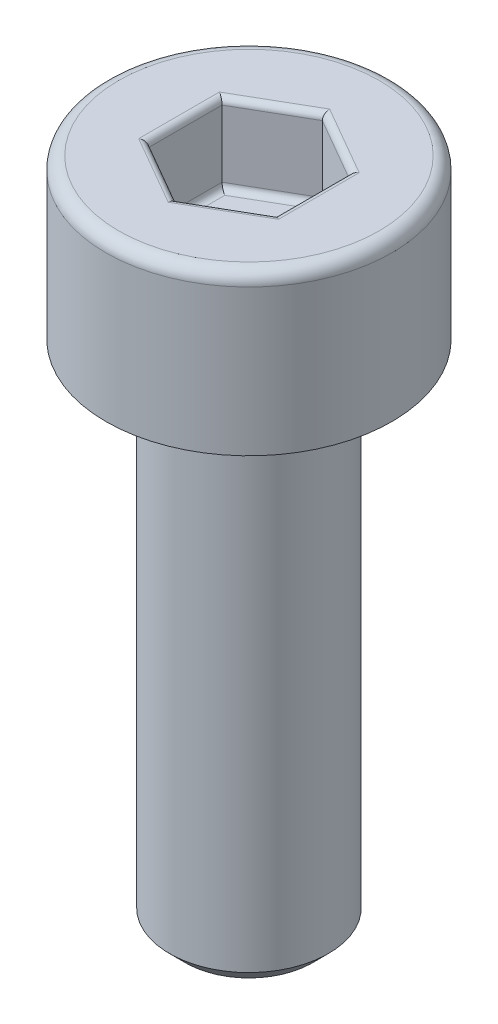
ISO-10303-21;
HEADER;
FILE_DESCRIPTION(('STEP AP214'),'2;1');
FILE_NAME('part.step','',(''),(''),'','','');
FILE_SCHEMA(('AUTOMOTIVE_DESIGN { 1 0 10303 214 1 1 1 1 }'));
ENDSEC;
DATA;
#1=APPLICATION_CONTEXT('core data for automotive mechanical design processes');
#2=APPLICATION_PROTOCOL_DEFINITION('international standard','automotive_design',2000,#1);
#3=PRODUCT_CONTEXT('',#1,'mechanical');
#4=PRODUCT('Part','Part','',(#3));
#5=PRODUCT_RELATED_PRODUCT_CATEGORY('part','',(#4));
#6=PRODUCT_DEFINITION_FORMATION('','',#4);
#7=PRODUCT_DEFINITION_CONTEXT('part definition',#1,'design');
#8=PRODUCT_DEFINITION('design','',#6,#7);
#9=PRODUCT_DEFINITION_SHAPE('','',#8);
#10=(LENGTH_UNIT() NAMED_UNIT(*) SI_UNIT(.MILLI.,.METRE.));
#11=(NAMED_UNIT(*) PLANE_ANGLE_UNIT() SI_UNIT($,.RADIAN.));
#12=(NAMED_UNIT(*) SI_UNIT($,.STERADIAN.) SOLID_ANGLE_UNIT());
#13=UNCERTAINTY_MEASURE_WITH_UNIT(LENGTH_MEASURE(1.E-05),#10,'distance_accuracy_value','');
#14=(GEOMETRIC_REPRESENTATION_CONTEXT(3) GLOBAL_UNCERTAINTY_ASSIGNED_CONTEXT((#13)) GLOBAL_UNIT_ASSIGNED_CONTEXT((#10,
#11,#12)) REPRESENTATION_CONTEXT('',''));
#15=CARTESIAN_POINT('',(0.,0.,0.));
#16=DIRECTION('',(0.,0.,1.));
#17=DIRECTION('',(1.,0.,0.));
#18=AXIS2_PLACEMENT_3D('',#15,#16,#17);
#19=CARTESIAN_POINT('',(0.,-10.5,0.));
#20=DIRECTION('',(0.,-1.,0.));
#21=DIRECTION('',(0.,0.,-1.));
#22=AXIS2_PLACEMENT_3D('',#19,#20,#21);
#23=PLANE('',#22);
#24=CARTESIAN_POINT('',(0.,-10.5,0.));
#25=DIRECTION('',(0.,-1.,0.));
#26=DIRECTION('',(0.,0.,-1.));
#27=AXIS2_PLACEMENT_3D('',#24,#25,#26);
#28=CIRCLE('',#27,0.999999999999999);
#29=CARTESIAN_POINT('',(0.,-10.5,-0.999999999999999));
#30=VERTEX_POINT('',#29);
#31=EDGE_CURVE('E261',#30,#30,#28,.T.);
#32=ORIENTED_EDGE('',*,*,#31,.T.);
#33=EDGE_LOOP('',(#32));
#34=FACE_BOUND('',#33,.T.);
#35=ADVANCED_FACE('F33',(#34),#23,.T.);
#36=CARTESIAN_POINT('',(0.,0.,0.));
#37=DIRECTION('',(0.,1.,0.));
#38=DIRECTION('',(0.,0.,1.));
#39=AXIS2_PLACEMENT_3D('',#36,#37,#38);
#40=CYLINDRICAL_SURFACE('',#39,1.25);
#41=CARTESIAN_POINT('',(0.,-2.75,0.));
#42=DIRECTION('',(0.,-1.,0.));
#43=DIRECTION('',(0.,0.,-1.));
#44=AXIS2_PLACEMENT_3D('',#41,#42,#43);
#45=CIRCLE('',#44,1.25);
#46=CARTESIAN_POINT('',(0.,-2.75,-1.25));
#47=VERTEX_POINT('',#46);
#48=EDGE_CURVE('E258',#47,#47,#45,.T.);
#49=ORIENTED_EDGE('',*,*,#48,.T.);
#50=EDGE_LOOP('',(#49));
#51=FACE_BOUND('',#50,.T.);
#52=CARTESIAN_POINT('',(0.,-10.25,0.));
#53=DIRECTION('',(0.,-1.,0.));
#54=DIRECTION('',(0.,0.,-1.));
#55=AXIS2_PLACEMENT_3D('',#52,#53,#54);
#56=CIRCLE('',#55,1.25);
#57=CARTESIAN_POINT('',(0.,-10.25,-1.25));
#58=VERTEX_POINT('',#57);
#59=EDGE_CURVE('E255',#58,#58,#56,.F.);
#60=ORIENTED_EDGE('',*,*,#59,.T.);
#61=EDGE_LOOP('',(#60));
#62=FACE_BOUND('',#61,.T.);
#63=ADVANCED_FACE('F287',(#51,#62),#40,.T.);
#64=CARTESIAN_POINT('',(-1.25,-2.5,0.));
#65=DIRECTION('',(0.,-1.,0.));
#66=DIRECTION('',(0.,0.,-1.));
#67=AXIS2_PLACEMENT_3D('',#64,#65,#66);
#68=PLANE('',#67);
#69=CARTESIAN_POINT('',(0.,-2.5,0.));
#70=DIRECTION('',(0.,-1.,0.));
#71=DIRECTION('',(0.,0.,-1.));
#72=AXIS2_PLACEMENT_3D('',#69,#70,#71);
#73=CIRCLE('',#72,1.5);
#74=CARTESIAN_POINT('',(0.,-2.5,-1.5));
#75=VERTEX_POINT('',#74);
#76=EDGE_CURVE('E252',#75,#75,#73,.F.);
#77=ORIENTED_EDGE('',*,*,#76,.T.);
#78=EDGE_LOOP('',(#77));
#79=FACE_BOUND('',#78,.T.);
#80=CARTESIAN_POINT('',(0.,-2.5,0.));
#81=DIRECTION('',(0.,1.,0.));
#82=DIRECTION('',(0.,0.,1.));
#83=AXIS2_PLACEMENT_3D('',#80,#81,#82);
#84=CIRCLE('',#83,2.25);
#85=CARTESIAN_POINT('',(0.,-2.5,2.25));
#86=VERTEX_POINT('',#85);
#87=EDGE_CURVE('E249',#86,#86,#84,.T.);
#88=ORIENTED_EDGE('',*,*,#87,.F.);
#89=EDGE_LOOP('',(#88));
#90=FACE_BOUND('',#89,.T.);
#91=ADVANCED_FACE('F293',(#79,#90),#68,.T.);
#92=CARTESIAN_POINT('',(0.,0.,0.));
#93=DIRECTION('',(0.,1.,0.));
#94=DIRECTION('',(0.,0.,1.));
#95=AXIS2_PLACEMENT_3D('',#92,#93,#94);
#96=CYLINDRICAL_SURFACE('',#95,2.25);
#97=CARTESIAN_POINT('',(0.,-0.2,0.));
#98=DIRECTION('',(0.,1.,0.));
#99=DIRECTION('',(0.,0.,1.));
#100=AXIS2_PLACEMENT_3D('',#97,#98,#99);
#101=CIRCLE('',#100,2.25);
#102=CARTESIAN_POINT('',(0.,-0.2,2.25));
#103=VERTEX_POINT('',#102);
#104=EDGE_CURVE('E159',#103,#103,#101,.F.);
#105=ORIENTED_EDGE('',*,*,#104,.T.);
#106=EDGE_LOOP('',(#105));
#107=FACE_BOUND('',#106,.T.);
#108=ORIENTED_EDGE('',*,*,#87,.T.);
#109=EDGE_LOOP('',(#108));
#110=FACE_BOUND('',#109,.T.);
#111=ADVANCED_FACE('F303',(#107,#110),#96,.T.);
#112=CARTESIAN_POINT('',(-2.25,0.,0.));
#113=DIRECTION('',(0.,1.,0.));
#114=DIRECTION('',(0.,0.,1.));
#115=AXIS2_PLACEMENT_3D('',#112,#113,#114);
#116=PLANE('',#115);
#117=DIRECTION('',(0.,0.,1.));
#118=VECTOR('',#117,1.);
#119=CARTESIAN_POINT('',(-1.1,0.,-0.577350269189627));
#120=LINE('',#119,#118);
#121=CARTESIAN_POINT('',(-1.1,0.,0.635085296108588));
#122=VERTEX_POINT('',#121);
#123=CARTESIAN_POINT('',(-1.1,0.,-0.635085296108589));
#124=VERTEX_POINT('',#123);
#125=EDGE_CURVE('E175',#122,#124,#120,.F.);
#126=ORIENTED_EDGE('',*,*,#125,.T.);
#127=DIRECTION('',(-0.866025403784439,0.,0.5));
#128=VECTOR('',#127,1.);
#129=CARTESIAN_POINT('',(-0.0500000000000009,0.,-1.2413030787577));
#130=LINE('',#129,#128);
#131=CARTESIAN_POINT('',(0.,0.,-1.27017059221718));
#132=VERTEX_POINT('',#131);
#133=EDGE_CURVE('E134',#124,#132,#130,.F.);
#134=ORIENTED_EDGE('',*,*,#133,.T.);
#135=DIRECTION('',(-0.866025403784439,0.,-0.5));
#136=VECTOR('',#135,1.);
#137=CARTESIAN_POINT('',(1.05,0.,-0.663952809568071));
#138=LINE('',#137,#136);
#139=CARTESIAN_POINT('',(1.1,0.,-0.63508529610859));
#140=VERTEX_POINT('',#139);
#141=EDGE_CURVE('E161',#132,#140,#138,.F.);
#142=ORIENTED_EDGE('',*,*,#141,.T.);
#143=DIRECTION('',(0.,0.,-1.));
#144=VECTOR('',#143,1.);
#145=CARTESIAN_POINT('',(1.1,0.,0.577350269189625));
#146=LINE('',#145,#144);
#147=CARTESIAN_POINT('',(1.1,0.,0.635085296108588));
#148=VERTEX_POINT('',#147);
#149=EDGE_CURVE('E169',#140,#148,#146,.F.);
#150=ORIENTED_EDGE('',*,*,#149,.T.);
#151=DIRECTION('',(0.866025403784439,0.,-0.5));
#152=VECTOR('',#151,1.);
#153=CARTESIAN_POINT('',(0.0499999999999991,0.,1.24130307875769));
#154=LINE('',#153,#152);
#155=CARTESIAN_POINT('',(0.,0.,1.27017059221718));
#156=VERTEX_POINT('',#155);
#157=EDGE_CURVE('E171',#148,#156,#154,.F.);
#158=ORIENTED_EDGE('',*,*,#157,.T.);
#159=DIRECTION('',(0.866025403784439,0.,0.5));
#160=VECTOR('',#159,1.);
#161=CARTESIAN_POINT('',(-1.05,0.,0.663952809568069));
#162=LINE('',#161,#160);
#163=EDGE_CURVE('E173',#156,#122,#162,.F.);
#164=ORIENTED_EDGE('',*,*,#163,.T.);
#165=EDGE_LOOP('',(#126,#134,#142,#150,#158,#164));
#166=FACE_BOUND('',#165,.T.);
#167=CARTESIAN_POINT('',(0.,0.,0.));
#168=DIRECTION('',(0.,1.,0.));
#169=DIRECTION('',(0.,0.,1.));
#170=AXIS2_PLACEMENT_3D('',#167,#168,#169);
#171=CIRCLE('',#170,2.05);
#172=CARTESIAN_POINT('',(0.,0.,2.05));
#173=VERTEX_POINT('',#172);
#174=EDGE_CURVE('E164',#173,#173,#171,.T.);
#175=ORIENTED_EDGE('',*,*,#174,.T.);
#176=EDGE_LOOP('',(#175));
#177=FACE_BOUND('',#176,.T.);
#178=ADVANCED_FACE('F266',(#166,#177),#116,.T.);
#179=CARTESIAN_POINT('',(0.,-2.5,0.));
#180=DIRECTION('',(0.,1.,0.));
#181=DIRECTION('',(0.,0.,1.));
#182=AXIS2_PLACEMENT_3D('',#179,#180,#181);
#183=CONICAL_SURFACE('',#182,1.5,0.785398163397452);
#184=ORIENTED_EDGE('',*,*,#48,.F.);
#185=EDGE_LOOP('',(#184));
#186=FACE_BOUND('',#185,.T.);
#187=ORIENTED_EDGE('',*,*,#76,.F.);
#188=EDGE_LOOP('',(#187));
#189=FACE_BOUND('',#188,.T.);
#190=ADVANCED_FACE('F281',(#186,#189),#183,.T.);
#191=CARTESIAN_POINT('',(0.,-10.25,0.));
#192=DIRECTION('',(0.,1.,0.));
#193=DIRECTION('',(0.,0.,1.));
#194=AXIS2_PLACEMENT_3D('',#191,#192,#193);
#195=CONICAL_SURFACE('',#194,1.25,0.785398163397454);
#196=ORIENTED_EDGE('',*,*,#31,.F.);
#197=EDGE_LOOP('',(#196));
#198=FACE_BOUND('',#197,.T.);
#199=ORIENTED_EDGE('',*,*,#59,.F.);
#200=EDGE_LOOP('',(#199));
#201=FACE_BOUND('',#200,.T.);
#202=ADVANCED_FACE('F271',(#198,#201),#195,.T.);
#203=CARTESIAN_POINT('',(0.,-0.2,0.));
#204=DIRECTION('',(0.,1.,0.));
#205=DIRECTION('',(0.,0.,1.));
#206=AXIS2_PLACEMENT_3D('',#203,#204,#205);
#207=TOROIDAL_SURFACE('',#206,2.05,0.2);
#208=ORIENTED_EDGE('',*,*,#104,.F.);
#209=EDGE_LOOP('',(#208));
#210=FACE_BOUND('',#209,.T.);
#211=ORIENTED_EDGE('',*,*,#174,.F.);
#212=EDGE_LOOP('',(#211));
#213=FACE_BOUND('',#212,.T.);
#214=ADVANCED_FACE('F268',(#210,#213),#207,.T.);
#215=CARTESIAN_POINT('',(0.999999999999998,-1.25,-0.577350269189627));
#216=DIRECTION('',(0.5,0.,-0.866025403784439));
#217=DIRECTION('',(-0.866025403784439,0.,-0.5));
#218=AXIS2_PLACEMENT_3D('',#215,#216,#217);
#219=PLANE('',#218);
#220=DIRECTION('',(0.,1.,0.));
#221=VECTOR('',#220,1.);
#222=CARTESIAN_POINT('',(0.999999999999998,-1.25,-0.577350269189627));
#223=LINE('',#222,#221);
#224=CARTESIAN_POINT('',(0.999999999999998,-1.15,-0.577350269189627));
#225=VERTEX_POINT('',#224);
#226=CARTESIAN_POINT('',(0.999999999999998,-0.1,-0.577350269189627));
#227=VERTEX_POINT('',#226);
#228=EDGE_CURVE('E243',#225,#227,#223,.T.);
#229=ORIENTED_EDGE('',*,*,#228,.T.);
#230=DIRECTION('',(-0.866025403784439,0.,-0.5));
#231=VECTOR('',#230,1.);
#232=CARTESIAN_POINT('',(0.,-0.1,-1.15470053837925));
#233=LINE('',#232,#231);
#234=CARTESIAN_POINT('',(0.,-0.1,-1.15470053837925));
#235=VERTEX_POINT('',#234);
#236=EDGE_CURVE('E195',#227,#235,#233,.T.);
#237=ORIENTED_EDGE('',*,*,#236,.T.);
#238=DIRECTION('',(0.,1.,0.));
#239=VECTOR('',#238,1.);
#240=CARTESIAN_POINT('',(0.,-1.25,-1.15470053837925));
#241=LINE('',#240,#239);
#242=CARTESIAN_POINT('',(0.,-1.15,-1.15470053837925));
#243=VERTEX_POINT('',#242);
#244=EDGE_CURVE('E145',#243,#235,#241,.T.);
#245=ORIENTED_EDGE('',*,*,#244,.F.);
#246=DIRECTION('',(-0.866025403784439,0.,-0.5));
#247=VECTOR('',#246,1.);
#248=CARTESIAN_POINT('',(0.999999999999998,-1.15,-0.577350269189627));
#249=LINE('',#248,#247);
#250=EDGE_CURVE('E193',#243,#225,#249,.F.);
#251=ORIENTED_EDGE('',*,*,#250,.T.);
#252=EDGE_LOOP('',(#229,#237,#245,#251));
#253=FACE_BOUND('',#252,.T.);
#254=ADVANCED_FACE('F270',(#253),#219,.F.);
#255=CARTESIAN_POINT('',(0.999999999999999,-1.25,0.577350269189625));
#256=DIRECTION('',(1.,0.,0.));
#257=DIRECTION('',(0.,0.,-1.));
#258=AXIS2_PLACEMENT_3D('',#255,#256,#257);
#259=PLANE('',#258);
#260=DIRECTION('',(0.,1.,0.));
#261=VECTOR('',#260,1.);
#262=CARTESIAN_POINT('',(0.999999999999999,-1.25,0.577350269189625));
#263=LINE('',#262,#261);
#264=CARTESIAN_POINT('',(0.999999999999999,-1.15,0.577350269189625));
#265=VERTEX_POINT('',#264);
#266=CARTESIAN_POINT('',(0.999999999999999,-0.1,0.577350269189625));
#267=VERTEX_POINT('',#266);
#268=EDGE_CURVE('E240',#265,#267,#263,.T.);
#269=ORIENTED_EDGE('',*,*,#268,.T.);
#270=DIRECTION('',(0.,0.,-1.));
#271=VECTOR('',#270,1.);
#272=CARTESIAN_POINT('',(0.999999999999998,-0.1,-0.577350269189627));
#273=LINE('',#272,#271);
#274=EDGE_CURVE('E191',#267,#227,#273,.T.);
#275=ORIENTED_EDGE('',*,*,#274,.T.);
#276=ORIENTED_EDGE('',*,*,#228,.F.);
#277=DIRECTION('',(0.,0.,-1.));
#278=VECTOR('',#277,1.);
#279=CARTESIAN_POINT('',(0.999999999999999,-1.15,0.577350269189625));
#280=LINE('',#279,#278);
#281=EDGE_CURVE('E188',#225,#265,#280,.F.);
#282=ORIENTED_EDGE('',*,*,#281,.T.);
#283=EDGE_LOOP('',(#269,#275,#276,#282));
#284=FACE_BOUND('',#283,.T.);
#285=ADVANCED_FACE('F278',(#284),#259,.F.);
#286=CARTESIAN_POINT('',(0.,-1.25,1.15470053837925));
#287=DIRECTION('',(0.5,0.,0.866025403784439));
#288=DIRECTION('',(0.866025403784439,0.,-0.5));
#289=AXIS2_PLACEMENT_3D('',#286,#287,#288);
#290=PLANE('',#289);
#291=DIRECTION('',(0.,1.,0.));
#292=VECTOR('',#291,1.);
#293=CARTESIAN_POINT('',(0.,-1.25,1.15470053837925));
#294=LINE('',#293,#292);
#295=CARTESIAN_POINT('',(0.,-1.15,1.15470053837925));
#296=VERTEX_POINT('',#295);
#297=CARTESIAN_POINT('',(0.,-0.1,1.15470053837925));
#298=VERTEX_POINT('',#297);
#299=EDGE_CURVE('E237',#296,#298,#294,.T.);
#300=ORIENTED_EDGE('',*,*,#299,.T.);
#301=DIRECTION('',(0.866025403784439,0.,-0.5));
#302=VECTOR('',#301,1.);
#303=CARTESIAN_POINT('',(0.999999999999999,-0.1,0.577350269189625));
#304=LINE('',#303,#302);
#305=EDGE_CURVE('E186',#298,#267,#304,.T.);
#306=ORIENTED_EDGE('',*,*,#305,.T.);
#307=ORIENTED_EDGE('',*,*,#268,.F.);
#308=DIRECTION('',(0.866025403784439,0.,-0.5));
#309=VECTOR('',#308,1.);
#310=CARTESIAN_POINT('',(0.,-1.15,1.15470053837925));
#311=LINE('',#310,#309);
#312=EDGE_CURVE('E184',#265,#296,#311,.F.);
#313=ORIENTED_EDGE('',*,*,#312,.T.);
#314=EDGE_LOOP('',(#300,#306,#307,#313));
#315=FACE_BOUND('',#314,.T.);
#316=ADVANCED_FACE('F327',(#315),#290,.F.);
#317=CARTESIAN_POINT('',(-1.,-1.25,0.577350269189625));
#318=DIRECTION('',(-0.5,0.,0.866025403784438));
#319=DIRECTION('',(0.866025403784439,0.,0.5));
#320=AXIS2_PLACEMENT_3D('',#317,#318,#319);
#321=PLANE('',#320);
#322=DIRECTION('',(0.,1.,0.));
#323=VECTOR('',#322,1.);
#324=CARTESIAN_POINT('',(-1.,-1.25,0.577350269189625));
#325=LINE('',#324,#323);
#326=CARTESIAN_POINT('',(-1.,-1.15,0.577350269189625));
#327=VERTEX_POINT('',#326);
#328=CARTESIAN_POINT('',(-1.,-0.1,0.577350269189625));
#329=VERTEX_POINT('',#328);
#330=EDGE_CURVE('E128',#327,#329,#325,.T.);
#331=ORIENTED_EDGE('',*,*,#330,.T.);
#332=DIRECTION('',(0.866025403784439,0.,0.5));
#333=VECTOR('',#332,1.);
#334=CARTESIAN_POINT('',(0.,-0.1,1.15470053837925));
#335=LINE('',#334,#333);
#336=EDGE_CURVE('E182',#329,#298,#335,.T.);
#337=ORIENTED_EDGE('',*,*,#336,.T.);
#338=ORIENTED_EDGE('',*,*,#299,.F.);
#339=DIRECTION('',(0.866025403784439,0.,0.5));
#340=VECTOR('',#339,1.);
#341=CARTESIAN_POINT('',(-1.,-1.15,0.577350269189625));
#342=LINE('',#341,#340);
#343=EDGE_CURVE('E180',#296,#327,#342,.F.);
#344=ORIENTED_EDGE('',*,*,#343,.T.);
#345=EDGE_LOOP('',(#331,#337,#338,#344));
#346=FACE_BOUND('',#345,.T.);
#347=ADVANCED_FACE('F234',(#346),#321,.F.);
#348=CARTESIAN_POINT('',(-1.,-1.25,-0.577350269189627));
#349=DIRECTION('',(-1.,0.,0.));
#350=DIRECTION('',(0.,0.,1.));
#351=AXIS2_PLACEMENT_3D('',#348,#349,#350);
#352=PLANE('',#351);
#353=DIRECTION('',(0.,1.,0.));
#354=VECTOR('',#353,1.);
#355=CARTESIAN_POINT('',(-1.,-1.25,-0.577350269189627));
#356=LINE('',#355,#354);
#357=CARTESIAN_POINT('',(-1.,-1.15,-0.577350269189627));
#358=VERTEX_POINT('',#357);
#359=CARTESIAN_POINT('',(-1.,-0.1,-0.577350269189627));
#360=VERTEX_POINT('',#359);
#361=EDGE_CURVE('E126',#358,#360,#356,.T.);
#362=ORIENTED_EDGE('',*,*,#361,.T.);
#363=DIRECTION('',(0.,0.,1.));
#364=VECTOR('',#363,1.);
#365=CARTESIAN_POINT('',(-1.,-0.1,0.577350269189625));
#366=LINE('',#365,#364);
#367=EDGE_CURVE('E133',#360,#329,#366,.T.);
#368=ORIENTED_EDGE('',*,*,#367,.T.);
#369=ORIENTED_EDGE('',*,*,#330,.F.);
#370=DIRECTION('',(0.,0.,1.));
#371=VECTOR('',#370,1.);
#372=CARTESIAN_POINT('',(-1.,-1.15,-0.577350269189627));
#373=LINE('',#372,#371);
#374=EDGE_CURVE('E123',#327,#358,#373,.F.);
#375=ORIENTED_EDGE('',*,*,#374,.T.);
#376=EDGE_LOOP('',(#362,#368,#369,#375));
#377=FACE_BOUND('',#376,.T.);
#378=ADVANCED_FACE('F125',(#377),#352,.F.);
#379=CARTESIAN_POINT('',(0.,-1.25,-1.15470053837925));
#380=DIRECTION('',(-0.5,0.,-0.866025403784438));
#381=DIRECTION('',(-0.866025403784439,0.,0.5));
#382=AXIS2_PLACEMENT_3D('',#379,#380,#381);
#383=PLANE('',#382);
#384=ORIENTED_EDGE('',*,*,#244,.T.);
#385=DIRECTION('',(-0.866025403784439,0.,0.5));
#386=VECTOR('',#385,1.);
#387=CARTESIAN_POINT('',(-1.,-0.1,-0.577350269189626));
#388=LINE('',#387,#386);
#389=EDGE_CURVE('E144',#235,#360,#388,.T.);
#390=ORIENTED_EDGE('',*,*,#389,.T.);
#391=ORIENTED_EDGE('',*,*,#361,.F.);
#392=DIRECTION('',(-0.866025403784439,0.,0.5));
#393=VECTOR('',#392,1.);
#394=CARTESIAN_POINT('',(0.,-1.15,-1.15470053837925));
#395=LINE('',#394,#393);
#396=EDGE_CURVE('E141',#358,#243,#395,.F.);
#397=ORIENTED_EDGE('',*,*,#396,.T.);
#398=EDGE_LOOP('',(#384,#390,#391,#397));
#399=FACE_BOUND('',#398,.T.);
#400=ADVANCED_FACE('F139',(#399),#383,.F.);
#401=CARTESIAN_POINT('',(0.,-1.25,-1.15470053837925));
#402=DIRECTION('',(0.,1.,0.));
#403=DIRECTION('',(0.,0.,1.));
#404=AXIS2_PLACEMENT_3D('',#401,#402,#403);
#405=PLANE('',#404);
#406=DIRECTION('',(0.866025403784439,0.,-0.5));
#407=VECTOR('',#406,1.);
#408=CARTESIAN_POINT('',(0.949999999999999,-1.25,0.490747728811181));
#409=LINE('',#408,#407);
#410=CARTESIAN_POINT('',(0.,-1.25,1.03923048454133));
#411=VERTEX_POINT('',#410);
#412=CARTESIAN_POINT('',(0.899999999999999,-1.25,0.519615242270663));
#413=VERTEX_POINT('',#412);
#414=EDGE_CURVE('E42',#411,#413,#409,.T.);
#415=ORIENTED_EDGE('',*,*,#414,.T.);
#416=DIRECTION('',(0.,0.,-1.));
#417=VECTOR('',#416,1.);
#418=CARTESIAN_POINT('',(0.899999999999998,-1.25,-1.15470053837925));
#419=LINE('',#418,#417);
#420=CARTESIAN_POINT('',(0.899999999999998,-1.25,-0.519615242270664));
#421=VERTEX_POINT('',#420);
#422=EDGE_CURVE('E11',#413,#421,#419,.T.);
#423=ORIENTED_EDGE('',*,*,#422,.T.);
#424=DIRECTION('',(-0.866025403784439,0.,-0.5));
#425=VECTOR('',#424,1.);
#426=CARTESIAN_POINT('',(-0.0500000000000008,-1.25,-1.06809799800081));
#427=LINE('',#426,#425);
#428=CARTESIAN_POINT('',(0.,-1.25,-1.03923048454133));
#429=VERTEX_POINT('',#428);
#430=EDGE_CURVE('E197',#421,#429,#427,.T.);
#431=ORIENTED_EDGE('',*,*,#430,.T.);
#432=DIRECTION('',(-0.866025403784439,0.,0.5));
#433=VECTOR('',#432,1.);
#434=CARTESIAN_POINT('',(0.0499999999999993,-1.25,-1.06809799800081));
#435=LINE('',#434,#433);
#436=CARTESIAN_POINT('',(-0.9,-1.25,-0.519615242270664));
#437=VERTEX_POINT('',#436);
#438=EDGE_CURVE('E199',#429,#437,#435,.T.);
#439=ORIENTED_EDGE('',*,*,#438,.T.);
#440=DIRECTION('',(0.,0.,1.));
#441=VECTOR('',#440,1.);
#442=CARTESIAN_POINT('',(-0.9,-1.25,-1.15470053837925));
#443=LINE('',#442,#441);
#444=CARTESIAN_POINT('',(-0.9,-1.25,0.519615242270662));
#445=VERTEX_POINT('',#444);
#446=EDGE_CURVE('E150',#437,#445,#443,.T.);
#447=ORIENTED_EDGE('',*,*,#446,.T.);
#448=DIRECTION('',(0.866025403784439,0.,0.5));
#449=VECTOR('',#448,1.);
#450=CARTESIAN_POINT('',(-0.950000000000001,-1.25,0.490747728811181));
#451=LINE('',#450,#449);
#452=EDGE_CURVE('E53',#445,#411,#451,.T.);
#453=ORIENTED_EDGE('',*,*,#452,.T.);
#454=EDGE_LOOP('',(#415,#423,#431,#439,#447,#453));
#455=FACE_BOUND('',#454,.T.);
#456=ADVANCED_FACE('F322',(#455),#405,.T.);
#457=CARTESIAN_POINT('',(0.0499999999999991,-0.1,1.24130307875769));
#458=DIRECTION('',(-0.866025403784439,0.,0.5));
#459=DIRECTION('',(0.5,0.,0.866025403784439));
#460=AXIS2_PLACEMENT_3D('',#457,#458,#459);
#461=CYLINDRICAL_SURFACE('',#460,0.1);
#462=CARTESIAN_POINT('',(0.,-0.1,1.27017059221718));
#463=DIRECTION('',(-1.,0.,0.));
#464=DIRECTION('',(0.,0.,-1.));
#465=AXIS2_PLACEMENT_3D('',#462,#463,#464);
#466=ELLIPSE('',#465,0.115470053837925,0.1);
#467=EDGE_CURVE('E214',#156,#298,#466,.T.);
#468=ORIENTED_EDGE('',*,*,#467,.F.);
#469=ORIENTED_EDGE('',*,*,#157,.F.);
#470=CARTESIAN_POINT('',(1.1,-0.1,0.635085296108588));
#471=DIRECTION('',(-0.5,0.,0.866025403784439));
#472=DIRECTION('',(-0.866025403784439,0.,-0.5));
#473=AXIS2_PLACEMENT_3D('',#470,#471,#472);
#474=ELLIPSE('',#473,0.115470053837925,0.1);
#475=EDGE_CURVE('E217',#267,#148,#474,.F.);
#476=ORIENTED_EDGE('',*,*,#475,.F.);
#477=ORIENTED_EDGE('',*,*,#305,.F.);
#478=EDGE_LOOP('',(#468,#469,#476,#477));
#479=FACE_BOUND('',#478,.T.);
#480=ADVANCED_FACE('F334',(#479),#461,.T.);
#481=CARTESIAN_POINT('',(1.1,-0.1,0.577350269189625));
#482=DIRECTION('',(0.,0.,1.));
#483=DIRECTION('',(1.,0.,0.));
#484=AXIS2_PLACEMENT_3D('',#481,#482,#483);
#485=CYLINDRICAL_SURFACE('',#484,0.1);
#486=ORIENTED_EDGE('',*,*,#475,.T.);
#487=ORIENTED_EDGE('',*,*,#149,.F.);
#488=CARTESIAN_POINT('',(1.1,-0.1,-0.63508529610859));
#489=DIRECTION('',(0.5,0.,0.866025403784439));
#490=DIRECTION('',(-0.866025403784439,0.,0.5));
#491=AXIS2_PLACEMENT_3D('',#488,#489,#490);
#492=ELLIPSE('',#491,0.115470053837925,0.1);
#493=EDGE_CURVE('E211',#227,#140,#492,.F.);
#494=ORIENTED_EDGE('',*,*,#493,.F.);
#495=ORIENTED_EDGE('',*,*,#274,.F.);
#496=EDGE_LOOP('',(#486,#487,#494,#495));
#497=FACE_BOUND('',#496,.T.);
#498=ADVANCED_FACE('F338',(#497),#485,.T.);
#499=CARTESIAN_POINT('',(-1.05,-0.1,0.663952809568069));
#500=DIRECTION('',(-0.866025403784439,0.,-0.5));
#501=DIRECTION('',(-0.5,0.,0.866025403784438));
#502=AXIS2_PLACEMENT_3D('',#499,#500,#501);
#503=CYLINDRICAL_SURFACE('',#502,0.1);
#504=ORIENTED_EDGE('',*,*,#467,.T.);
#505=ORIENTED_EDGE('',*,*,#336,.F.);
#506=CARTESIAN_POINT('',(-1.1,-0.1,0.635085296108587));
#507=DIRECTION('',(-0.5,0.,-0.866025403784439));
#508=DIRECTION('',(0.866025403784439,0.,-0.5));
#509=AXIS2_PLACEMENT_3D('',#506,#507,#508);
#510=ELLIPSE('',#509,0.115470053837925,0.1);
#511=EDGE_CURVE('E208',#122,#329,#510,.T.);
#512=ORIENTED_EDGE('',*,*,#511,.F.);
#513=ORIENTED_EDGE('',*,*,#163,.F.);
#514=EDGE_LOOP('',(#504,#505,#512,#513));
#515=FACE_BOUND('',#514,.T.);
#516=ADVANCED_FACE('F344',(#515),#503,.T.);
#517=CARTESIAN_POINT('',(1.05,-0.1,-0.663952809568071));
#518=DIRECTION('',(0.866025403784439,0.,0.5));
#519=DIRECTION('',(0.5,0.,-0.866025403784439));
#520=AXIS2_PLACEMENT_3D('',#517,#518,#519);
#521=CYLINDRICAL_SURFACE('',#520,0.1);
#522=ORIENTED_EDGE('',*,*,#493,.T.);
#523=ORIENTED_EDGE('',*,*,#141,.F.);
#524=CARTESIAN_POINT('',(0.,-0.1,-1.27017059221718));
#525=DIRECTION('',(1.,0.,0.));
#526=DIRECTION('',(0.,0.,-1.));
#527=AXIS2_PLACEMENT_3D('',#524,#525,#526);
#528=ELLIPSE('',#527,0.115470053837925,0.1);
#529=EDGE_CURVE('E206',#235,#132,#528,.F.);
#530=ORIENTED_EDGE('',*,*,#529,.F.);
#531=ORIENTED_EDGE('',*,*,#236,.F.);
#532=EDGE_LOOP('',(#522,#523,#530,#531));
#533=FACE_BOUND('',#532,.T.);
#534=ADVANCED_FACE('F374',(#533),#521,.T.);
#535=CARTESIAN_POINT('',(-1.1,-0.1,-0.577350269189627));
#536=DIRECTION('',(0.,0.,-1.));
#537=DIRECTION('',(-1.,0.,0.));
#538=AXIS2_PLACEMENT_3D('',#535,#536,#537);
#539=CYLINDRICAL_SURFACE('',#538,0.1);
#540=ORIENTED_EDGE('',*,*,#511,.T.);
#541=ORIENTED_EDGE('',*,*,#367,.F.);
#542=CARTESIAN_POINT('',(-1.1,-0.1,-0.635085296108589));
#543=DIRECTION('',(0.5,0.,-0.866025403784439));
#544=DIRECTION('',(0.866025403784439,0.,0.5));
#545=AXIS2_PLACEMENT_3D('',#542,#543,#544);
#546=ELLIPSE('',#545,0.115470053837925,0.1);
#547=EDGE_CURVE('E204',#124,#360,#546,.T.);
#548=ORIENTED_EDGE('',*,*,#547,.F.);
#549=ORIENTED_EDGE('',*,*,#125,.F.);
#550=EDGE_LOOP('',(#540,#541,#548,#549));
#551=FACE_BOUND('',#550,.T.);
#552=ADVANCED_FACE('F369',(#551),#539,.T.);
#553=CARTESIAN_POINT('',(-0.0500000000000009,-0.1,-1.2413030787577));
#554=DIRECTION('',(0.866025403784439,0.,-0.5));
#555=DIRECTION('',(-0.5,0.,-0.866025403784438));
#556=AXIS2_PLACEMENT_3D('',#553,#554,#555);
#557=CYLINDRICAL_SURFACE('',#556,0.1);
#558=ORIENTED_EDGE('',*,*,#529,.T.);
#559=ORIENTED_EDGE('',*,*,#133,.F.);
#560=ORIENTED_EDGE('',*,*,#547,.T.);
#561=ORIENTED_EDGE('',*,*,#389,.F.);
#562=EDGE_LOOP('',(#558,#559,#560,#561));
#563=FACE_BOUND('',#562,.T.);
#564=ADVANCED_FACE('F365',(#563),#557,.T.);
#565=CARTESIAN_POINT('',(-0.9,-1.15,-1.15470053837925));
#566=DIRECTION('',(0.,0.,1.));
#567=DIRECTION('',(1.,0.,0.));
#568=AXIS2_PLACEMENT_3D('',#565,#566,#567);
#569=CYLINDRICAL_SURFACE('',#568,0.1);
#570=CARTESIAN_POINT('',(-0.900000000000001,-1.15,-0.519615242270664));
#571=DIRECTION('',(-0.5,0.,0.866025403784439));
#572=DIRECTION('',(0.866025403784439,0.,0.5));
#573=AXIS2_PLACEMENT_3D('',#570,#571,#572);
#574=ELLIPSE('',#573,0.115470053837925,0.1);
#575=EDGE_CURVE('E149',#358,#437,#574,.T.);
#576=ORIENTED_EDGE('',*,*,#575,.F.);
#577=ORIENTED_EDGE('',*,*,#374,.F.);
#578=CARTESIAN_POINT('',(-0.9,-1.15,0.519615242270662));
#579=DIRECTION('',(0.5,0.,0.866025403784439));
#580=DIRECTION('',(0.866025403784439,0.,-0.5));
#581=AXIS2_PLACEMENT_3D('',#578,#579,#580);
#582=ELLIPSE('',#581,0.115470053837925,0.1);
#583=EDGE_CURVE('E37',#445,#327,#582,.F.);
#584=ORIENTED_EDGE('',*,*,#583,.F.);
#585=ORIENTED_EDGE('',*,*,#446,.F.);
#586=EDGE_LOOP('',(#576,#577,#584,#585));
#587=FACE_BOUND('',#586,.T.);
#588=ADVANCED_FACE('F35',(#587),#569,.F.);
#589=CARTESIAN_POINT('',(-0.950000000000001,-1.15,0.490747728811181));
#590=DIRECTION('',(0.866025403784439,0.,0.5));
#591=DIRECTION('',(0.5,0.,-0.866025403784438));
#592=AXIS2_PLACEMENT_3D('',#589,#590,#591);
#593=CYLINDRICAL_SURFACE('',#592,0.1);
#594=ORIENTED_EDGE('',*,*,#583,.T.);
#595=ORIENTED_EDGE('',*,*,#343,.F.);
#596=CARTESIAN_POINT('',(0.,-1.15,1.03923048454133));
#597=DIRECTION('',(1.,0.,0.));
#598=DIRECTION('',(0.,0.,-1.));
#599=AXIS2_PLACEMENT_3D('',#596,#597,#598);
#600=ELLIPSE('',#599,0.115470053837925,0.1);
#601=EDGE_CURVE('E153',#411,#296,#600,.F.);
#602=ORIENTED_EDGE('',*,*,#601,.F.);
#603=ORIENTED_EDGE('',*,*,#452,.F.);
#604=EDGE_LOOP('',(#594,#595,#602,#603));
#605=FACE_BOUND('',#604,.T.);
#606=ADVANCED_FACE('F231',(#605),#593,.F.);
#607=CARTESIAN_POINT('',(0.0499999999999993,-1.15,-1.06809799800081));
#608=DIRECTION('',(-0.866025403784439,0.,0.5));
#609=DIRECTION('',(0.5,0.,0.866025403784438));
#610=AXIS2_PLACEMENT_3D('',#607,#608,#609);
#611=CYLINDRICAL_SURFACE('',#610,0.1);
#612=ORIENTED_EDGE('',*,*,#575,.T.);
#613=ORIENTED_EDGE('',*,*,#438,.F.);
#614=CARTESIAN_POINT('',(0.,-1.15,-1.03923048454133));
#615=DIRECTION('',(-1.,0.,0.));
#616=DIRECTION('',(0.,0.,1.));
#617=AXIS2_PLACEMENT_3D('',#614,#615,#616);
#618=ELLIPSE('',#617,0.115470053837925,0.1);
#619=EDGE_CURVE('E157',#243,#429,#618,.T.);
#620=ORIENTED_EDGE('',*,*,#619,.F.);
#621=ORIENTED_EDGE('',*,*,#396,.F.);
#622=EDGE_LOOP('',(#612,#613,#620,#621));
#623=FACE_BOUND('',#622,.T.);
#624=ADVANCED_FACE('F155',(#623),#611,.F.);
#625=CARTESIAN_POINT('',(0.949999999999999,-1.15,0.490747728811181));
#626=DIRECTION('',(0.866025403784439,0.,-0.5));
#627=DIRECTION('',(-0.5,0.,-0.866025403784439));
#628=AXIS2_PLACEMENT_3D('',#625,#626,#627);
#629=CYLINDRICAL_SURFACE('',#628,0.1);
#630=ORIENTED_EDGE('',*,*,#601,.T.);
#631=ORIENTED_EDGE('',*,*,#312,.F.);
#632=CARTESIAN_POINT('',(0.899999999999999,-1.15,0.519615242270662));
#633=DIRECTION('',(0.5,0.,-0.866025403784439));
#634=DIRECTION('',(-0.866025403784439,0.,-0.5));
#635=AXIS2_PLACEMENT_3D('',#632,#633,#634);
#636=ELLIPSE('',#635,0.115470053837925,0.1);
#637=EDGE_CURVE('E222',#413,#265,#636,.F.);
#638=ORIENTED_EDGE('',*,*,#637,.F.);
#639=ORIENTED_EDGE('',*,*,#414,.F.);
#640=EDGE_LOOP('',(#630,#631,#638,#639));
#641=FACE_BOUND('',#640,.T.);
#642=ADVANCED_FACE('F228',(#641),#629,.F.);
#643=CARTESIAN_POINT('',(-0.0500000000000008,-1.15,-1.06809799800081));
#644=DIRECTION('',(-0.866025403784439,0.,-0.5));
#645=DIRECTION('',(-0.5,0.,0.866025403784439));
#646=AXIS2_PLACEMENT_3D('',#643,#644,#645);
#647=CYLINDRICAL_SURFACE('',#646,0.1);
#648=ORIENTED_EDGE('',*,*,#619,.T.);
#649=ORIENTED_EDGE('',*,*,#430,.F.);
#650=CARTESIAN_POINT('',(0.899999999999998,-1.15,-0.519615242270664));
#651=DIRECTION('',(-0.5,0.,-0.866025403784439));
#652=DIRECTION('',(0.866025403784439,0.,-0.5));
#653=AXIS2_PLACEMENT_3D('',#650,#651,#652);
#654=ELLIPSE('',#653,0.115470053837925,0.1);
#655=EDGE_CURVE('E220',#225,#421,#654,.T.);
#656=ORIENTED_EDGE('',*,*,#655,.F.);
#657=ORIENTED_EDGE('',*,*,#250,.F.);
#658=EDGE_LOOP('',(#648,#649,#656,#657));
#659=FACE_BOUND('',#658,.T.);
#660=ADVANCED_FACE('F353',(#659),#647,.F.);
#661=CARTESIAN_POINT('',(0.899999999999998,-1.15,-1.15470053837925));
#662=DIRECTION('',(0.,0.,-1.));
#663=DIRECTION('',(-1.,0.,0.));
#664=AXIS2_PLACEMENT_3D('',#661,#662,#663);
#665=CYLINDRICAL_SURFACE('',#664,0.1);
#666=ORIENTED_EDGE('',*,*,#637,.T.);
#667=ORIENTED_EDGE('',*,*,#281,.F.);
#668=ORIENTED_EDGE('',*,*,#655,.T.);
#669=ORIENTED_EDGE('',*,*,#422,.F.);
#670=EDGE_LOOP('',(#666,#667,#668,#669));
#671=FACE_BOUND('',#670,.T.);
#672=ADVANCED_FACE('F350',(#671),#665,.F.);
#673=CLOSED_SHELL('',(#35,#63,#91,#111,#178,#190,#202,#214,#254,#285,#316,#347,#378,#400,#456,
#480,#498,#516,#534,#552,#564,#588,#606,#624,#642,#660,#672));
#674=MANIFOLD_SOLID_BREP('B2',#673);
#675=ADVANCED_BREP_SHAPE_REPRESENTATION('',(#18,#674),#14);
#676=SHAPE_DEFINITION_REPRESENTATION(#9,#675);
ENDSEC;
END-ISO-10303-21;
